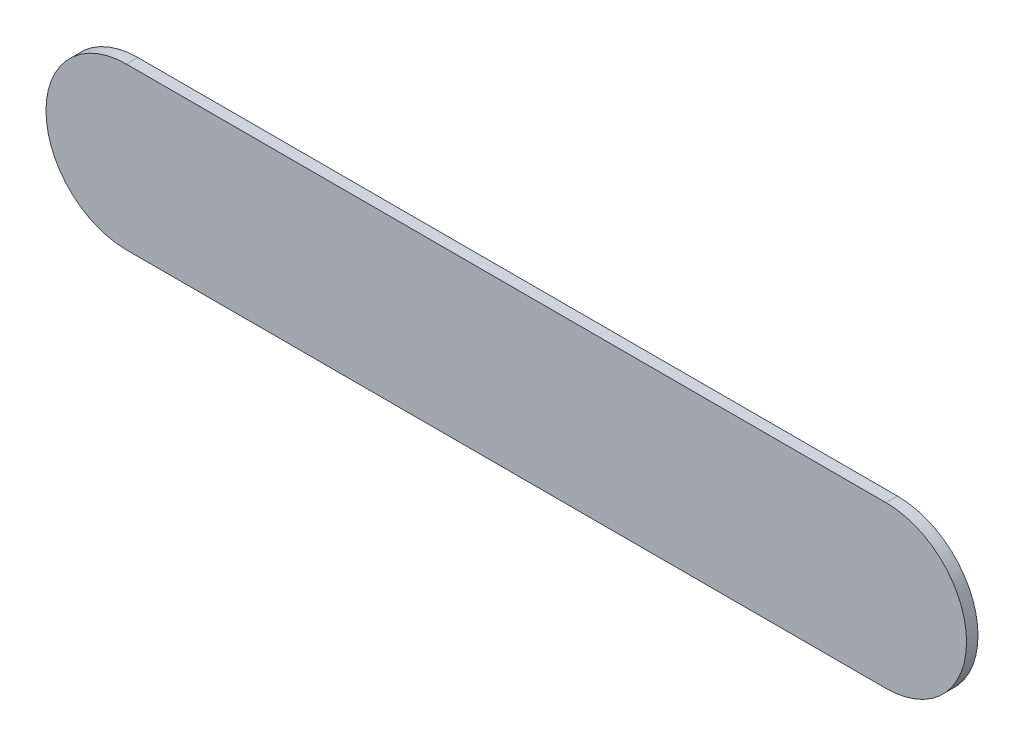
ISO-10303-21;
HEADER;
FILE_DESCRIPTION(('STEP AP214'),'2;1');
FILE_NAME('part.step','',(''),(''),'','','');
FILE_SCHEMA(('AUTOMOTIVE_DESIGN { 1 0 10303 214 1 1 1 1 }'));
ENDSEC;
DATA;
#1=APPLICATION_CONTEXT('core data for automotive mechanical design processes');
#2=APPLICATION_PROTOCOL_DEFINITION('international standard','automotive_design',2000,#1);
#3=PRODUCT_CONTEXT('',#1,'mechanical');
#4=PRODUCT('Part','Part','',(#3));
#5=PRODUCT_RELATED_PRODUCT_CATEGORY('part','',(#4));
#6=PRODUCT_DEFINITION_FORMATION('','',#4);
#7=PRODUCT_DEFINITION_CONTEXT('part definition',#1,'design');
#8=PRODUCT_DEFINITION('design','',#6,#7);
#9=PRODUCT_DEFINITION_SHAPE('','',#8);
#10=(LENGTH_UNIT() NAMED_UNIT(*) SI_UNIT(.MILLI.,.METRE.));
#11=(NAMED_UNIT(*) PLANE_ANGLE_UNIT() SI_UNIT($,.RADIAN.));
#12=(NAMED_UNIT(*) SI_UNIT($,.STERADIAN.) SOLID_ANGLE_UNIT());
#13=UNCERTAINTY_MEASURE_WITH_UNIT(LENGTH_MEASURE(1.E-05),#10,'distance_accuracy_value','');
#14=(GEOMETRIC_REPRESENTATION_CONTEXT(3) GLOBAL_UNCERTAINTY_ASSIGNED_CONTEXT((#13)) GLOBAL_UNIT_ASSIGNED_CONTEXT((#10,
#11,#12)) REPRESENTATION_CONTEXT('',''));
#15=CARTESIAN_POINT('',(0.,0.,0.));
#16=DIRECTION('',(0.,0.,1.));
#17=DIRECTION('',(1.,0.,0.));
#18=AXIS2_PLACEMENT_3D('',#15,#16,#17);
#19=CARTESIAN_POINT('',(92.5458144,97.7432005,0.));
#20=DIRECTION('',(0.,1.,0.));
#21=DIRECTION('',(1.,0.,0.));
#22=AXIS2_PLACEMENT_3D('',#19,#20,#21);
#23=PLANE('',#22);
#24=DIRECTION('',(1.,0.,0.));
#25=VECTOR('',#24,1.);
#26=CARTESIAN_POINT('',(92.5458144,97.7432005,0.03556));
#27=LINE('',#26,#25);
#28=CARTESIAN_POINT('',(92.5458144,97.7432005,0.03556));
#29=VERTEX_POINT('',#28);
#30=CARTESIAN_POINT('',(94.90680028,97.7432005,0.03556));
#31=VERTEX_POINT('',#30);
#32=EDGE_CURVE('E11',#29,#31,#27,.T.);
#33=ORIENTED_EDGE('',*,*,#32,.F.);
#34=DIRECTION('',(0.,0.,1.));
#35=VECTOR('',#34,1.);
#36=CARTESIAN_POINT('',(92.5458144,97.7432005,0.));
#37=LINE('',#36,#35);
#38=CARTESIAN_POINT('',(92.5458144,97.7432005,0.));
#39=VERTEX_POINT('',#38);
#40=EDGE_CURVE('E24',#39,#29,#37,.T.);
#41=ORIENTED_EDGE('',*,*,#40,.F.);
#42=DIRECTION('',(1.,0.,0.));
#43=VECTOR('',#42,1.);
#44=CARTESIAN_POINT('',(92.5458144,97.7432005,0.));
#45=LINE('',#44,#43);
#46=CARTESIAN_POINT('',(94.90680028,97.7432005,0.));
#47=VERTEX_POINT('',#46);
#48=EDGE_CURVE('E75',#39,#47,#45,.T.);
#49=ORIENTED_EDGE('',*,*,#48,.T.);
#50=DIRECTION('',(0.,0.,1.));
#51=VECTOR('',#50,1.);
#52=CARTESIAN_POINT('',(94.90680028,97.7432005,0.));
#53=LINE('',#52,#51);
#54=EDGE_CURVE('E37',#47,#31,#53,.T.);
#55=ORIENTED_EDGE('',*,*,#54,.T.);
#56=EDGE_LOOP('',(#33,#41,#49,#55));
#57=FACE_BOUND('',#56,.T.);
#58=ADVANCED_FACE('F17',(#57),#23,.F.);
#59=CARTESIAN_POINT('',(94.90680028,97.9932,0.));
#60=DIRECTION('',(0.,0.,-1.));
#61=DIRECTION('',(0.,-1.,0.));
#62=AXIS2_PLACEMENT_3D('',#59,#60,#61);
#63=CYLINDRICAL_SURFACE('',#62,0.249999500000001);
#64=CARTESIAN_POINT('',(94.90680028,97.9932,0.03556));
#65=DIRECTION('',(0.,0.,1.));
#66=DIRECTION('',(0.,-1.,0.));
#67=AXIS2_PLACEMENT_3D('',#64,#65,#66);
#68=CIRCLE('',#67,0.249999500000001);
#69=CARTESIAN_POINT('',(94.90680028,98.2431995,0.03556));
#70=VERTEX_POINT('',#69);
#71=EDGE_CURVE('E83',#31,#70,#68,.T.);
#72=ORIENTED_EDGE('',*,*,#71,.F.);
#73=ORIENTED_EDGE('',*,*,#54,.F.);
#74=CARTESIAN_POINT('',(94.90680028,97.9932,0.));
#75=DIRECTION('',(0.,0.,1.));
#76=DIRECTION('',(0.,-1.,0.));
#77=AXIS2_PLACEMENT_3D('',#74,#75,#76);
#78=CIRCLE('',#77,0.249999500000001);
#79=CARTESIAN_POINT('',(94.90680028,98.2431995,0.));
#80=VERTEX_POINT('',#79);
#81=EDGE_CURVE('E81',#47,#80,#78,.T.);
#82=ORIENTED_EDGE('',*,*,#81,.T.);
#83=DIRECTION('',(0.,0.,1.));
#84=VECTOR('',#83,1.);
#85=CARTESIAN_POINT('',(94.90680028,98.2431995,0.));
#86=LINE('',#85,#84);
#87=EDGE_CURVE('E67',#80,#70,#86,.T.);
#88=ORIENTED_EDGE('',*,*,#87,.T.);
#89=EDGE_LOOP('',(#72,#73,#82,#88));
#90=FACE_BOUND('',#89,.T.);
#91=ADVANCED_FACE('F89',(#90),#63,.T.);
#92=CARTESIAN_POINT('',(94.90680028,98.2431995,0.));
#93=DIRECTION('',(0.,-1.,0.));
#94=DIRECTION('',(-1.,0.,0.));
#95=AXIS2_PLACEMENT_3D('',#92,#93,#94);
#96=PLANE('',#95);
#97=DIRECTION('',(-1.,0.,0.));
#98=VECTOR('',#97,1.);
#99=CARTESIAN_POINT('',(94.90680028,98.2431995,0.03556));
#100=LINE('',#99,#98);
#101=CARTESIAN_POINT('',(92.5458144,98.2431995,0.03556));
#102=VERTEX_POINT('',#101);
#103=EDGE_CURVE('E71',#70,#102,#100,.T.);
#104=ORIENTED_EDGE('',*,*,#103,.F.);
#105=ORIENTED_EDGE('',*,*,#87,.F.);
#106=DIRECTION('',(-1.,0.,0.));
#107=VECTOR('',#106,1.);
#108=CARTESIAN_POINT('',(94.90680028,98.2431995,0.));
#109=LINE('',#108,#107);
#110=CARTESIAN_POINT('',(92.5458144,98.2431995,0.));
#111=VERTEX_POINT('',#110);
#112=EDGE_CURVE('E63',#80,#111,#109,.T.);
#113=ORIENTED_EDGE('',*,*,#112,.T.);
#114=DIRECTION('',(0.,0.,1.));
#115=VECTOR('',#114,1.);
#116=CARTESIAN_POINT('',(92.5458144,98.2431995,0.));
#117=LINE('',#116,#115);
#118=EDGE_CURVE('E53',#111,#102,#117,.T.);
#119=ORIENTED_EDGE('',*,*,#118,.T.);
#120=EDGE_LOOP('',(#104,#105,#113,#119));
#121=FACE_BOUND('',#120,.T.);
#122=ADVANCED_FACE('F66',(#121),#96,.F.);
#123=CARTESIAN_POINT('',(92.5458144,97.9932,0.));
#124=DIRECTION('',(0.,0.,-1.));
#125=DIRECTION('',(0.,1.,0.));
#126=AXIS2_PLACEMENT_3D('',#123,#124,#125);
#127=CYLINDRICAL_SURFACE('',#126,0.249999500000001);
#128=CARTESIAN_POINT('',(92.5458144,97.9932,0.03556));
#129=DIRECTION('',(0.,0.,1.));
#130=DIRECTION('',(0.,1.,0.));
#131=AXIS2_PLACEMENT_3D('',#128,#129,#130);
#132=CIRCLE('',#131,0.249999500000001);
#133=EDGE_CURVE('E59',#102,#29,#132,.T.);
#134=ORIENTED_EDGE('',*,*,#133,.F.);
#135=ORIENTED_EDGE('',*,*,#118,.F.);
#136=CARTESIAN_POINT('',(92.5458144,97.9932,0.));
#137=DIRECTION('',(0.,0.,1.));
#138=DIRECTION('',(0.,1.,0.));
#139=AXIS2_PLACEMENT_3D('',#136,#137,#138);
#140=CIRCLE('',#139,0.249999500000001);
#141=EDGE_CURVE('E57',#111,#39,#140,.T.);
#142=ORIENTED_EDGE('',*,*,#141,.T.);
#143=ORIENTED_EDGE('',*,*,#40,.T.);
#144=EDGE_LOOP('',(#134,#135,#142,#143));
#145=FACE_BOUND('',#144,.T.);
#146=ADVANCED_FACE('F55',(#145),#127,.T.);
#147=CARTESIAN_POINT('',(92.5458144,97.7432005,0.));
#148=DIRECTION('',(0.,0.,-1.));
#149=DIRECTION('',(-1.,0.,0.));
#150=AXIS2_PLACEMENT_3D('',#147,#148,#149);
#151=PLANE('',#150);
#152=ORIENTED_EDGE('',*,*,#141,.F.);
#153=ORIENTED_EDGE('',*,*,#112,.F.);
#154=ORIENTED_EDGE('',*,*,#81,.F.);
#155=ORIENTED_EDGE('',*,*,#48,.F.);
#156=EDGE_LOOP('',(#152,#153,#154,#155));
#157=FACE_BOUND('',#156,.T.);
#158=ADVANCED_FACE('F74',(#157),#151,.T.);
#159=CARTESIAN_POINT('',(92.5458144,97.7432005,0.03556));
#160=DIRECTION('',(0.,0.,-1.));
#161=DIRECTION('',(-1.,0.,0.));
#162=AXIS2_PLACEMENT_3D('',#159,#160,#161);
#163=PLANE('',#162);
#164=ORIENTED_EDGE('',*,*,#32,.T.);
#165=ORIENTED_EDGE('',*,*,#71,.T.);
#166=ORIENTED_EDGE('',*,*,#103,.T.);
#167=ORIENTED_EDGE('',*,*,#133,.T.);
#168=EDGE_LOOP('',(#164,#165,#166,#167));
#169=FACE_BOUND('',#168,.T.);
#170=ADVANCED_FACE('F91',(#169),#163,.F.);
#171=CLOSED_SHELL('',(#58,#91,#122,#146,#158,#170));
#172=MANIFOLD_SOLID_BREP('B1',#171);
#173=ADVANCED_BREP_SHAPE_REPRESENTATION('',(#18,#172),#14);
#174=SHAPE_DEFINITION_REPRESENTATION(#9,#173);
ENDSEC;
END-ISO-10303-21;
